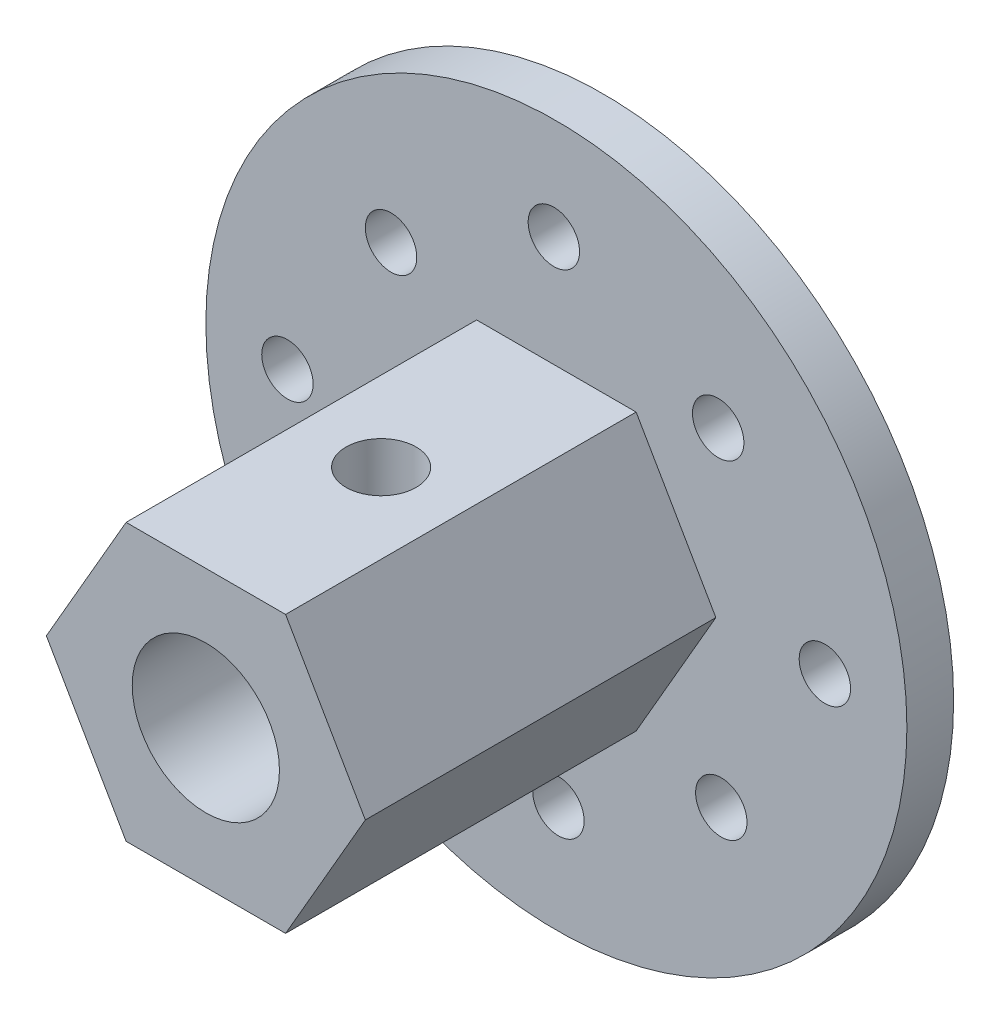
ISO-10303-21;
HEADER;
FILE_DESCRIPTION(('STEP AP214'),'2;1');
FILE_NAME('part.step','',(''),(''),'','','');
FILE_SCHEMA(('AUTOMOTIVE_DESIGN { 1 0 10303 214 1 1 1 1 }'));
ENDSEC;
DATA;
#1=APPLICATION_CONTEXT('core data for automotive mechanical design processes');
#2=APPLICATION_PROTOCOL_DEFINITION('international standard','automotive_design',2000,#1);
#3=PRODUCT_CONTEXT('',#1,'mechanical');
#4=PRODUCT('Part','Part','',(#3));
#5=PRODUCT_RELATED_PRODUCT_CATEGORY('part','',(#4));
#6=PRODUCT_DEFINITION_FORMATION('','',#4);
#7=PRODUCT_DEFINITION_CONTEXT('part definition',#1,'design');
#8=PRODUCT_DEFINITION('design','',#6,#7);
#9=PRODUCT_DEFINITION_SHAPE('','',#8);
#10=(LENGTH_UNIT() NAMED_UNIT(*) SI_UNIT(.MILLI.,.METRE.));
#11=(NAMED_UNIT(*) PLANE_ANGLE_UNIT() SI_UNIT($,.RADIAN.));
#12=(NAMED_UNIT(*) SI_UNIT($,.STERADIAN.) SOLID_ANGLE_UNIT());
#13=UNCERTAINTY_MEASURE_WITH_UNIT(LENGTH_MEASURE(1.E-05),#10,'distance_accuracy_value','');
#14=(GEOMETRIC_REPRESENTATION_CONTEXT(3) GLOBAL_UNCERTAINTY_ASSIGNED_CONTEXT((#13)) GLOBAL_UNIT_ASSIGNED_CONTEXT((#10,
#11,#12)) REPRESENTATION_CONTEXT('',''));
#15=CARTESIAN_POINT('',(0.,0.,0.));
#16=DIRECTION('',(0.,0.,1.));
#17=DIRECTION('',(1.,0.,0.));
#18=AXIS2_PLACEMENT_3D('',#15,#16,#17);
#19=CARTESIAN_POINT('',(0.,-5.9106233808288,15.));
#20=DIRECTION('',(0.,1.,0.));
#21=DIRECTION('',(-1.,0.,0.));
#22=AXIS2_PLACEMENT_3D('',#19,#20,#21);
#23=PLANE('',#22);
#24=CARTESIAN_POINT('',(0.,-5.9106233808288,7.5));
#25=DIRECTION('',(0.,1.,0.));
#26=DIRECTION('',(-1.,0.,0.));
#27=AXIS2_PLACEMENT_3D('',#24,#25,#26);
#28=CIRCLE('',#27,1.5);
#29=CARTESIAN_POINT('',(-1.5,-5.9106233808288,7.5));
#30=VERTEX_POINT('',#29);
#31=EDGE_CURVE('E222',#30,#30,#28,.T.);
#32=ORIENTED_EDGE('',*,*,#31,.T.);
#33=EDGE_LOOP('',(#32));
#34=FACE_BOUND('',#33,.T.);
#35=DIRECTION('',(1.,0.,0.));
#36=VECTOR('',#35,1.);
#37=CARTESIAN_POINT('',(0.,-5.9106233808288,0.));
#38=LINE('',#37,#36);
#39=CARTESIAN_POINT('',(-3.4125,-5.91062338082879,0.));
#40=VERTEX_POINT('',#39);
#41=CARTESIAN_POINT('',(3.4125,-5.9106233808288,0.));
#42=VERTEX_POINT('',#41);
#43=EDGE_CURVE('E97',#40,#42,#38,.T.);
#44=ORIENTED_EDGE('',*,*,#43,.T.);
#45=DIRECTION('',(0.,0.,-1.));
#46=VECTOR('',#45,1.);
#47=CARTESIAN_POINT('',(3.4125,-5.9106233808288,15.));
#48=LINE('',#47,#46);
#49=CARTESIAN_POINT('',(3.4125,-5.9106233808288,15.));
#50=VERTEX_POINT('',#49);
#51=EDGE_CURVE('E11',#50,#42,#48,.T.);
#52=ORIENTED_EDGE('',*,*,#51,.F.);
#53=DIRECTION('',(1.,0.,0.));
#54=VECTOR('',#53,1.);
#55=CARTESIAN_POINT('',(0.,-5.9106233808288,15.));
#56=LINE('',#55,#54);
#57=CARTESIAN_POINT('',(-3.4125,-5.91062338082879,15.));
#58=VERTEX_POINT('',#57);
#59=EDGE_CURVE('E283',#58,#50,#56,.T.);
#60=ORIENTED_EDGE('',*,*,#59,.F.);
#61=DIRECTION('',(0.,0.,-1.));
#62=VECTOR('',#61,1.);
#63=CARTESIAN_POINT('',(-3.4125,-5.91062338082879,15.));
#64=LINE('',#63,#62);
#65=EDGE_CURVE('E111',#58,#40,#64,.T.);
#66=ORIENTED_EDGE('',*,*,#65,.T.);
#67=EDGE_LOOP('',(#44,#52,#60,#66));
#68=FACE_BOUND('',#67,.T.);
#69=ADVANCED_FACE('F37',(#34,#68),#23,.F.);
#70=CARTESIAN_POINT('',(5.11875,-2.9553116904144,15.));
#71=DIRECTION('',(-0.866025403784439,0.5,0.));
#72=DIRECTION('',(-0.5,-0.866025403784439,0.));
#73=AXIS2_PLACEMENT_3D('',#70,#71,#72);
#74=PLANE('',#73);
#75=DIRECTION('',(0.5,0.866025403784439,0.));
#76=VECTOR('',#75,1.);
#77=CARTESIAN_POINT('',(5.11875,-2.9553116904144,0.));
#78=LINE('',#77,#76);
#79=CARTESIAN_POINT('',(6.825,0.,0.));
#80=VERTEX_POINT('',#79);
#81=EDGE_CURVE('E93',#42,#80,#78,.T.);
#82=ORIENTED_EDGE('',*,*,#81,.T.);
#83=DIRECTION('',(0.,0.,-1.));
#84=VECTOR('',#83,1.);
#85=CARTESIAN_POINT('',(6.825,0.,15.));
#86=LINE('',#85,#84);
#87=CARTESIAN_POINT('',(6.825,0.,15.));
#88=VERTEX_POINT('',#87);
#89=EDGE_CURVE('E52',#88,#80,#86,.T.);
#90=ORIENTED_EDGE('',*,*,#89,.F.);
#91=DIRECTION('',(0.5,0.866025403784439,0.));
#92=VECTOR('',#91,1.);
#93=CARTESIAN_POINT('',(5.11875,-2.9553116904144,15.));
#94=LINE('',#93,#92);
#95=EDGE_CURVE('E107',#50,#88,#94,.T.);
#96=ORIENTED_EDGE('',*,*,#95,.F.);
#97=ORIENTED_EDGE('',*,*,#51,.T.);
#98=EDGE_LOOP('',(#82,#90,#96,#97));
#99=FACE_BOUND('',#98,.T.);
#100=ADVANCED_FACE('F106',(#99),#74,.F.);
#101=CARTESIAN_POINT('',(5.11875,2.9553116904144,15.));
#102=DIRECTION('',(-0.866025403784439,-0.5,0.));
#103=DIRECTION('',(0.5,-0.866025403784439,0.));
#104=AXIS2_PLACEMENT_3D('',#101,#102,#103);
#105=PLANE('',#104);
#106=DIRECTION('',(-0.5,0.866025403784439,0.));
#107=VECTOR('',#106,1.);
#108=CARTESIAN_POINT('',(5.11875,2.9553116904144,0.));
#109=LINE('',#108,#107);
#110=CARTESIAN_POINT('',(3.4125,5.9106233808288,0.));
#111=VERTEX_POINT('',#110);
#112=EDGE_CURVE('E100',#80,#111,#109,.T.);
#113=ORIENTED_EDGE('',*,*,#112,.T.);
#114=DIRECTION('',(0.,0.,-1.));
#115=VECTOR('',#114,1.);
#116=CARTESIAN_POINT('',(3.4125,5.9106233808288,15.));
#117=LINE('',#116,#115);
#118=CARTESIAN_POINT('',(3.4125,5.9106233808288,15.));
#119=VERTEX_POINT('',#118);
#120=EDGE_CURVE('E137',#119,#111,#117,.T.);
#121=ORIENTED_EDGE('',*,*,#120,.F.);
#122=DIRECTION('',(-0.5,0.866025403784439,0.));
#123=VECTOR('',#122,1.);
#124=CARTESIAN_POINT('',(5.11875,2.9553116904144,15.));
#125=LINE('',#124,#123);
#126=EDGE_CURVE('E286',#88,#119,#125,.T.);
#127=ORIENTED_EDGE('',*,*,#126,.F.);
#128=ORIENTED_EDGE('',*,*,#89,.T.);
#129=EDGE_LOOP('',(#113,#121,#127,#128));
#130=FACE_BOUND('',#129,.T.);
#131=ADVANCED_FACE('F210',(#130),#105,.F.);
#132=CARTESIAN_POINT('',(0.,5.9106233808288,15.));
#133=DIRECTION('',(0.,-1.,0.));
#134=DIRECTION('',(1.,0.,0.));
#135=AXIS2_PLACEMENT_3D('',#132,#133,#134);
#136=PLANE('',#135);
#137=CARTESIAN_POINT('',(0.,5.9106233808288,7.5));
#138=DIRECTION('',(0.,1.,0.));
#139=DIRECTION('',(-1.,0.,0.));
#140=AXIS2_PLACEMENT_3D('',#137,#138,#139);
#141=CIRCLE('',#140,1.5);
#142=CARTESIAN_POINT('',(-1.5,5.9106233808288,7.5));
#143=VERTEX_POINT('',#142);
#144=EDGE_CURVE('E145',#143,#143,#141,.T.);
#145=ORIENTED_EDGE('',*,*,#144,.F.);
#146=EDGE_LOOP('',(#145));
#147=FACE_BOUND('',#146,.T.);
#148=DIRECTION('',(-1.,0.,0.));
#149=VECTOR('',#148,1.);
#150=CARTESIAN_POINT('',(0.,5.9106233808288,0.));
#151=LINE('',#150,#149);
#152=CARTESIAN_POINT('',(-3.4125,5.9106233808288,0.));
#153=VERTEX_POINT('',#152);
#154=EDGE_CURVE('E121',#111,#153,#151,.T.);
#155=ORIENTED_EDGE('',*,*,#154,.T.);
#156=DIRECTION('',(0.,0.,-1.));
#157=VECTOR('',#156,1.);
#158=CARTESIAN_POINT('',(-3.4125,5.9106233808288,15.));
#159=LINE('',#158,#157);
#160=CARTESIAN_POINT('',(-3.4125,5.9106233808288,15.));
#161=VERTEX_POINT('',#160);
#162=EDGE_CURVE('E134',#161,#153,#159,.T.);
#163=ORIENTED_EDGE('',*,*,#162,.F.);
#164=DIRECTION('',(-1.,0.,0.));
#165=VECTOR('',#164,1.);
#166=CARTESIAN_POINT('',(0.,5.9106233808288,15.));
#167=LINE('',#166,#165);
#168=EDGE_CURVE('E288',#119,#161,#167,.T.);
#169=ORIENTED_EDGE('',*,*,#168,.F.);
#170=ORIENTED_EDGE('',*,*,#120,.T.);
#171=EDGE_LOOP('',(#155,#163,#169,#170));
#172=FACE_BOUND('',#171,.T.);
#173=ADVANCED_FACE('F206',(#147,#172),#136,.F.);
#174=CARTESIAN_POINT('',(-5.11875,2.9553116904144,15.));
#175=DIRECTION('',(0.866025403784439,-0.5,0.));
#176=DIRECTION('',(0.5,0.866025403784439,0.));
#177=AXIS2_PLACEMENT_3D('',#174,#175,#176);
#178=PLANE('',#177);
#179=DIRECTION('',(-0.5,-0.866025403784439,0.));
#180=VECTOR('',#179,1.);
#181=CARTESIAN_POINT('',(-5.11875,2.9553116904144,0.));
#182=LINE('',#181,#180);
#183=CARTESIAN_POINT('',(-6.825,0.,0.));
#184=VERTEX_POINT('',#183);
#185=EDGE_CURVE('E124',#153,#184,#182,.T.);
#186=ORIENTED_EDGE('',*,*,#185,.T.);
#187=DIRECTION('',(0.,0.,-1.));
#188=VECTOR('',#187,1.);
#189=CARTESIAN_POINT('',(-6.825,0.,15.));
#190=LINE('',#189,#188);
#191=CARTESIAN_POINT('',(-6.825,0.,15.));
#192=VERTEX_POINT('',#191);
#193=EDGE_CURVE('E131',#192,#184,#190,.T.);
#194=ORIENTED_EDGE('',*,*,#193,.F.);
#195=DIRECTION('',(-0.5,-0.866025403784439,0.));
#196=VECTOR('',#195,1.);
#197=CARTESIAN_POINT('',(-5.11875,2.9553116904144,15.));
#198=LINE('',#197,#196);
#199=EDGE_CURVE('E289',#161,#192,#198,.T.);
#200=ORIENTED_EDGE('',*,*,#199,.F.);
#201=ORIENTED_EDGE('',*,*,#162,.T.);
#202=EDGE_LOOP('',(#186,#194,#200,#201));
#203=FACE_BOUND('',#202,.T.);
#204=ADVANCED_FACE('F203',(#203),#178,.F.);
#205=CARTESIAN_POINT('',(0.,0.,15.));
#206=DIRECTION('',(0.,0.,-1.));
#207=DIRECTION('',(-1.,0.,0.));
#208=AXIS2_PLACEMENT_3D('',#205,#206,#207);
#209=CYLINDRICAL_SURFACE('',#208,3.15);
#210=CARTESIAN_POINT('',(-1.5,-2.76992779689291,7.5));
#211=CARTESIAN_POINT('',(-1.49999512828054,-2.76993355691465,7.57872488532269));
#212=CARTESIAN_POINT('',(-1.49376181526376,-2.77333403488741,7.65756185561535));
#213=CARTESIAN_POINT('',(-1.46912569232975,-2.78645890771976,7.81286106870493));
#214=CARTESIAN_POINT('',(-1.45069492745545,-2.79619782860643,7.88931743301203));
#215=CARTESIAN_POINT('',(-1.40260850542124,-2.82062152123807,8.03732147343197));
#216=CARTESIAN_POINT('',(-1.37300820581179,-2.8352818629121,8.10889133468752));
#217=CARTESIAN_POINT('',(-1.30359090354353,-2.86785913338934,8.24603198704063));
#218=CARTESIAN_POINT('',(-1.26377419981075,-2.88577596690503,8.31160295358621));
#219=CARTESIAN_POINT('',(-1.17157340786821,-2.92448170601209,8.44028578083248));
#220=CARTESIAN_POINT('',(-1.11847444649718,-2.94538512566762,8.50285124762856));
#221=CARTESIAN_POINT('',(-1.00270750312831,-2.98678034208223,8.61860748151321));
#222=CARTESIAN_POINT('',(-0.940035134894633,-3.00727194526521,8.67179392723941));
#223=CARTESIAN_POINT('',(-0.802317251690317,-3.04700129599587,8.77038371492235));
#224=CARTESIAN_POINT('',(-0.726756178783365,-3.06609096429287,8.81513211812391));
#225=CARTESIAN_POINT('',(-0.56810053101371,-3.09940545699353,8.89103604275899));
#226=CARTESIAN_POINT('',(-0.485010311532368,-3.11363307150366,8.92219936287959));
#227=CARTESIAN_POINT('',(-0.319429022533573,-3.13479947496421,8.96794099194401));
#228=CARTESIAN_POINT('',(-0.237255730091782,-3.14215492850824,8.98347258106389));
#229=CARTESIAN_POINT('',(-0.0711644119017913,-3.15029110072656,9.00063147644495));
#230=CARTESIAN_POINT('',(0.0127526438372442,-3.15107538154907,9.00226631596237));
#231=CARTESIAN_POINT('',(0.17285517871007,-3.14619314795333,8.99199352604636));
#232=CARTESIAN_POINT('',(0.249127419883694,-3.14103170182195,8.98114628383523));
#233=CARTESIAN_POINT('',(0.398616200858829,-3.12558047721987,8.94809051131312));
#234=CARTESIAN_POINT('',(0.471832512939892,-3.11529031730662,8.92588113595246));
#235=CARTESIAN_POINT('',(0.61446159029421,-3.09034956876121,8.87053915939075));
#236=CARTESIAN_POINT('',(0.683802738834998,-3.07563718497101,8.83725098731157));
#237=CARTESIAN_POINT('',(0.816091361413133,-3.04321219161389,8.76088636320448));
#238=CARTESIAN_POINT('',(0.879036485250617,-3.02549848555182,8.7178063318733));
#239=CARTESIAN_POINT('',(1.00263565644441,-2.98693359674348,8.61871978348667));
#240=CARTESIAN_POINT('',(1.0626034705047,-2.96594349598994,8.56191048118762));
#241=CARTESIAN_POINT('',(1.17251105126579,-2.92424012507112,8.43915500531423));
#242=CARTESIAN_POINT('',(1.22244433756614,-2.90352704181393,8.37320297342745));
#243=CARTESIAN_POINT('',(1.3134528172033,-2.86355477768291,8.22968339508249));
#244=CARTESIAN_POINT('',(1.35391191761259,-2.84443247625902,8.15168342647286));
#245=CARTESIAN_POINT('',(1.42083061462904,-2.81160888291967,7.98884448260634));
#246=CARTESIAN_POINT('',(1.4473035975326,-2.79790241062308,7.90401213667877));
#247=CARTESIAN_POINT('',(1.48347362827959,-2.7788839951775,7.73676167517786));
#248=CARTESIAN_POINT('',(1.49429589447754,-2.77301167486687,7.65465266939844));
#249=CARTESIAN_POINT('',(1.50223397235311,-2.76872169565055,7.48959977548907));
#250=CARTESIAN_POINT('',(1.49935759309064,-2.7702997895518,7.40665638991228));
#251=CARTESIAN_POINT('',(1.48101219124526,-2.78014161682937,7.2506272582168));
#252=CARTESIAN_POINT('',(1.46676047668064,-2.78775860512234,7.17735138756969));
#253=CARTESIAN_POINT('',(1.42781659425282,-2.80790253393829,7.0343443678185));
#254=CARTESIAN_POINT('',(1.4031214003218,-2.82043089748814,6.96461425268626));
#255=CARTESIAN_POINT('',(1.34276490341884,-2.84967581803499,6.82703139696087));
#256=CARTESIAN_POINT('',(1.30664900322602,-2.86655936350107,6.75941487156065));
#257=CARTESIAN_POINT('',(1.22488682758906,-2.90243763216396,6.63082541251736));
#258=CARTESIAN_POINT('',(1.17923577082519,-2.92143341227884,6.56985583536057));
#259=CARTESIAN_POINT('',(1.07370241705516,-2.96195883240757,6.44914911308566));
#260=CARTESIAN_POINT('',(1.01279842919393,-2.98353379263769,6.39031643670938));
#261=CARTESIAN_POINT('',(0.881582089646963,-3.02490381214683,6.28345862793802));
#262=CARTESIAN_POINT('',(0.811267455642678,-3.04469843769656,6.23543612488326));
#263=CARTESIAN_POINT('',(0.661420256758403,-3.08075602911564,6.15090877907066));
#264=CARTESIAN_POINT('',(0.581746602897407,-3.09695030800855,6.11462276623818));
#265=CARTESIAN_POINT('',(0.416436183797379,-3.12347018905937,6.05630827954424));
#266=CARTESIAN_POINT('',(0.330804221585407,-3.13380045809116,6.03426846589809));
#267=CARTESIAN_POINT('',(0.16395502730365,-3.14674636742887,6.00680095019335));
#268=CARTESIAN_POINT('',(0.0829908258945927,-3.14994869644787,6.00010840477039));
#269=CARTESIAN_POINT('',(-0.0789479789493272,-3.15005000669313,5.99989431882655));
#270=CARTESIAN_POINT('',(-0.159922572680317,-3.14695080219962,6.00636898732128));
#271=CARTESIAN_POINT('',(-0.314828784707275,-3.13513721365548,6.03143068136368));
#272=CARTESIAN_POINT('',(-0.388900742448287,-3.12674738284226,6.04931828339357));
#273=CARTESIAN_POINT('',(-0.532900023334838,-3.10544993028493,6.09581160586742));
#274=CARTESIAN_POINT('',(-0.602826693967297,-3.09254159947649,6.12441900856275));
#275=CARTESIAN_POINT('',(-0.740049022805659,-3.06267525837221,6.19291509294018));
#276=CARTESIAN_POINT('',(-0.80708598335687,-3.04556157311282,6.23325223242839));
#277=CARTESIAN_POINT('',(-0.933730397713657,-3.00915215544564,6.32347980584785));
#278=CARTESIAN_POINT('',(-0.993334440684814,-2.98985542896844,6.37337459917846));
#279=CARTESIAN_POINT('',(-1.10911159559092,-2.94897855229333,6.48658564710739));
#280=CARTESIAN_POINT('',(-1.16448035503823,-2.92735028268804,6.55070963645063));
#281=CARTESIAN_POINT('',(-1.26391547857037,-2.88581526519611,6.68778712048229));
#282=CARTESIAN_POINT('',(-1.30797333352128,-2.86590982080038,6.76074720214469));
#283=CARTESIAN_POINT('',(-1.3840936929618,-2.82994621207585,6.91532774518253));
#284=CARTESIAN_POINT('',(-1.41592364698007,-2.81396454115983,6.99708149975433));
#285=CARTESIAN_POINT('',(-1.46489257204971,-2.78879350795625,7.16572186137652));
#286=CARTESIAN_POINT('',(-1.48208085585884,-2.7795813606081,7.25259017719949));
#287=CARTESIAN_POINT('',(-1.49431908572158,-2.77299732052517,7.36686147740226));
#288=CARTESIAN_POINT('',(-1.49644673622212,-2.77184948473868,7.39342693789545));
#289=CARTESIAN_POINT('',(-1.4992880568787,-2.77031372650367,7.44665730497053));
#290=CARTESIAN_POINT('',(-1.50000165089698,-2.76992584497376,7.47332221682977));
#291=CARTESIAN_POINT('',(-1.5,-2.76992779689291,7.5));
#292=B_SPLINE_CURVE_WITH_KNOTS('',3,(#210,#211,#212,#213,#214,#215,#216,#217,#218,#219,#220,
#221,#222,#223,#224,#225,#226,#227,#228,#229,#230,#231,#232,#233,#234,#235,#236,#237,#238,#239,
#240,#241,#242,#243,#244,#245,#246,#247,#248,#249,#250,#251,#252,#253,#254,#255,#256,#257,#258,
#259,#260,#261,#262,#263,#264,#265,#266,#267,#268,#269,#270,#271,#272,#273,#274,#275,#276,#277,
#278,#279,#280,#281,#282,#283,#284,#285,#286,#287,#288,#289,#290,#291),.UNSPECIFIED.,.T.,.F.,(4,
2,2,2,2,2,2,2,2,2,2,2,2,2,2,2,2,2,2,2,2,2,2,2,2,2,2,2,2,2,2,2,2,2,2,2,2,2,2,2,4),(0.,
0.236062528288999,0.47266796322516,0.708115835199148,0.94355681889115,1.196523813196,
1.44960705864778,1.71781237472466,1.98586352077446,2.23634315664763,2.48668700194077,
2.71723982814652,2.94780980403002,3.18176463911911,3.41580513167643,3.67039162386814,
3.9251420059496,4.19350831731647,4.46161730429607,4.70928363591595,4.95680879958984,
5.18091237777868,5.40508093601456,5.63962346787715,5.87428389258181,6.13525202478639,
6.39628356341156,6.66193382710884,6.92737237549041,7.16999959899019,7.41255697735767,
7.64151551807625,7.87051000416771,8.10977586194789,8.34915111370967,8.61028530696864,
8.87161537822315,9.13769476445408,9.40287441868371,9.48286546420592,9.56286081660936),.UNSPECIFIED.);
#293=CARTESIAN_POINT('',(-1.5,-2.76992779689291,7.5));
#294=VERTEX_POINT('',#293);
#295=EDGE_CURVE('E42',#294,#294,#292,.T.);
#296=ORIENTED_EDGE('',*,*,#295,.F.);
#297=EDGE_LOOP('',(#296));
#298=FACE_BOUND('',#297,.T.);
#299=CARTESIAN_POINT('',(-1.5,2.76992779689291,7.5));
#300=CARTESIAN_POINT('',(-1.49999512828054,2.76993355691465,7.42127511467731));
#301=CARTESIAN_POINT('',(-1.49376181526375,2.77333403488741,7.34243814438465));
#302=CARTESIAN_POINT('',(-1.46912569232975,2.78645890771976,7.18713893129507));
#303=CARTESIAN_POINT('',(-1.45069492745545,2.79619782860643,7.11068256698797));
#304=CARTESIAN_POINT('',(-1.40260850542124,2.82062152123807,6.96267852656803));
#305=CARTESIAN_POINT('',(-1.37300820581179,2.8352818629121,6.89110866531248));
#306=CARTESIAN_POINT('',(-1.30359090354353,2.86785913338934,6.75396801295937));
#307=CARTESIAN_POINT('',(-1.26377419981075,2.88577596690503,6.68839704641379));
#308=CARTESIAN_POINT('',(-1.17157340786822,2.92448170601209,6.55971421916753));
#309=CARTESIAN_POINT('',(-1.11847444649718,2.94538512566762,6.49714875237144));
#310=CARTESIAN_POINT('',(-1.00270750312832,2.98678034208223,6.3813925184868));
#311=CARTESIAN_POINT('',(-0.940035134894635,3.00727194526521,6.32820607276059));
#312=CARTESIAN_POINT('',(-0.80231725169032,3.04700129599587,6.22961628507766));
#313=CARTESIAN_POINT('',(-0.726756178783368,3.06609096429287,6.18486788187609));
#314=CARTESIAN_POINT('',(-0.568100531013713,3.09940545699353,6.10896395724102));
#315=CARTESIAN_POINT('',(-0.485010311532371,3.11363307150366,6.07780063712041));
#316=CARTESIAN_POINT('',(-0.319429022533576,3.13479947496421,6.03205900805599));
#317=CARTESIAN_POINT('',(-0.237255730091784,3.14215492850824,6.01652741893612));
#318=CARTESIAN_POINT('',(-0.0711644119017936,3.15029110072656,5.99936852355505));
#319=CARTESIAN_POINT('',(0.0127526438372422,3.15107538154907,5.99773368403763));
#320=CARTESIAN_POINT('',(0.172855178710069,3.14619314795334,6.00800647395364));
#321=CARTESIAN_POINT('',(0.249127419883693,3.14103170182195,6.01885371616476));
#322=CARTESIAN_POINT('',(0.398616200858829,3.12558047721987,6.05190948868687));
#323=CARTESIAN_POINT('',(0.471832512939892,3.11529031730662,6.07411886404754));
#324=CARTESIAN_POINT('',(0.61446159029421,3.09034956876121,6.12946084060924));
#325=CARTESIAN_POINT('',(0.683802738834999,3.07563718497101,6.16274901268843));
#326=CARTESIAN_POINT('',(0.816091361413134,3.04321219161389,6.23911363679552));
#327=CARTESIAN_POINT('',(0.879036485250618,3.02549848555182,6.2821936681267));
#328=CARTESIAN_POINT('',(1.00263565644441,2.98693359674348,6.38128021651333));
#329=CARTESIAN_POINT('',(1.0626034705047,2.96594349598994,6.43808951881239));
#330=CARTESIAN_POINT('',(1.17251105126579,2.92424012507112,6.56084499468577));
#331=CARTESIAN_POINT('',(1.22244433756614,2.90352704181393,6.62679702657255));
#332=CARTESIAN_POINT('',(1.3134528172033,2.8635547776829,6.77031660491751));
#333=CARTESIAN_POINT('',(1.35391191761259,2.84443247625901,6.84831657352714));
#334=CARTESIAN_POINT('',(1.42083061462904,2.81160888291967,7.01115551739366));
#335=CARTESIAN_POINT('',(1.4473035975326,2.79790241062308,7.09598786332123));
#336=CARTESIAN_POINT('',(1.48347362827959,2.7788839951775,7.26323832482214));
#337=CARTESIAN_POINT('',(1.49429589447754,2.77301167486687,7.34534733060156));
#338=CARTESIAN_POINT('',(1.50223397235311,2.76872169565055,7.51040022451093));
#339=CARTESIAN_POINT('',(1.49935759309064,2.7702997895518,7.59334361008771));
#340=CARTESIAN_POINT('',(1.48101219124526,2.78014161682937,7.7493727417832));
#341=CARTESIAN_POINT('',(1.46676047668064,2.78775860512234,7.82264861243031));
#342=CARTESIAN_POINT('',(1.42781659425282,2.80790253393829,7.96565563218149));
#343=CARTESIAN_POINT('',(1.4031214003218,2.82043089748814,8.03538574731374));
#344=CARTESIAN_POINT('',(1.34276490341884,2.84967581803499,8.17296860303912));
#345=CARTESIAN_POINT('',(1.30664900322602,2.86655936350107,8.24058512843934));
#346=CARTESIAN_POINT('',(1.22488682758907,2.90243763216396,8.36917458748264));
#347=CARTESIAN_POINT('',(1.1792357708252,2.92143341227884,8.43014416463942));
#348=CARTESIAN_POINT('',(1.07370241705516,2.96195883240757,8.55085088691434));
#349=CARTESIAN_POINT('',(1.01279842919393,2.98353379263769,8.60968356329061));
#350=CARTESIAN_POINT('',(0.881582089646968,3.02490381214683,8.71654137206197));
#351=CARTESIAN_POINT('',(0.811267455642682,3.04469843769656,8.76456387511674));
#352=CARTESIAN_POINT('',(0.661420256758408,3.08075602911564,8.84909122092933));
#353=CARTESIAN_POINT('',(0.581746602897413,3.09695030800854,8.88537723376182));
#354=CARTESIAN_POINT('',(0.416436183797384,3.12347018905937,8.94369172045575));
#355=CARTESIAN_POINT('',(0.330804221585413,3.13380045809116,8.96573153410191));
#356=CARTESIAN_POINT('',(0.163955027303656,3.14674636742887,8.99319904980665));
#357=CARTESIAN_POINT('',(0.0829908258945979,3.14994869644787,8.99989159522961));
#358=CARTESIAN_POINT('',(-0.0789479789493226,3.15005000669313,9.00010568117345));
#359=CARTESIAN_POINT('',(-0.159922572680313,3.14695080219962,8.99363101267872));
#360=CARTESIAN_POINT('',(-0.31482878470727,3.13513721365548,8.96856931863632));
#361=CARTESIAN_POINT('',(-0.388900742448283,3.12674738284226,8.95068171660643));
#362=CARTESIAN_POINT('',(-0.532900023334834,3.10544993028493,8.90418839413258));
#363=CARTESIAN_POINT('',(-0.602826693967294,3.09254159947649,8.87558099143725));
#364=CARTESIAN_POINT('',(-0.740049022805657,3.06267525837221,8.80708490705982));
#365=CARTESIAN_POINT('',(-0.807085983356869,3.04556157311282,8.76674776757161));
#366=CARTESIAN_POINT('',(-0.933730397713656,3.00915215544564,8.67652019415215));
#367=CARTESIAN_POINT('',(-0.993334440684814,2.98985542896844,8.62662540082154));
#368=CARTESIAN_POINT('',(-1.10911159559092,2.94897855229333,8.51341435289261));
#369=CARTESIAN_POINT('',(-1.16448035503823,2.92735028268804,8.44929036354937));
#370=CARTESIAN_POINT('',(-1.26391547857037,2.88581526519611,8.31221287951771));
#371=CARTESIAN_POINT('',(-1.30797333352127,2.86590982080038,8.23925279785531));
#372=CARTESIAN_POINT('',(-1.3840936929618,2.82994621207585,8.08467225481747));
#373=CARTESIAN_POINT('',(-1.41592364698007,2.81396454115983,8.00291850024567));
#374=CARTESIAN_POINT('',(-1.4648925720497,2.78879350795625,7.83427813862348));
#375=CARTESIAN_POINT('',(-1.48208085585884,2.7795813606081,7.74740982280051));
#376=CARTESIAN_POINT('',(-1.49431908572158,2.77299732052517,7.63313852259774));
#377=CARTESIAN_POINT('',(-1.49644673622212,2.77184948473868,7.60657306210455));
#378=CARTESIAN_POINT('',(-1.4992880568787,2.77031372650367,7.55334269502947));
#379=CARTESIAN_POINT('',(-1.50000165089698,2.76992584497376,7.52667778317023));
#380=CARTESIAN_POINT('',(-1.5,2.76992779689291,7.5));
#381=B_SPLINE_CURVE_WITH_KNOTS('',3,(#299,#300,#301,#302,#303,#304,#305,#306,#307,#308,#309,
#310,#311,#312,#313,#314,#315,#316,#317,#318,#319,#320,#321,#322,#323,#324,#325,#326,#327,#328,
#329,#330,#331,#332,#333,#334,#335,#336,#337,#338,#339,#340,#341,#342,#343,#344,#345,#346,#347,
#348,#349,#350,#351,#352,#353,#354,#355,#356,#357,#358,#359,#360,#361,#362,#363,#364,#365,#366,
#367,#368,#369,#370,#371,#372,#373,#374,#375,#376,#377,#378,#379,#380),.UNSPECIFIED.,.T.,.F.,(4,
2,2,2,2,2,2,2,2,2,2,2,2,2,2,2,2,2,2,2,2,2,2,2,2,2,2,2,2,2,2,2,2,2,2,2,2,2,2,2,4),(0.,
0.236062528288998,0.472667963225158,0.708115835199147,0.943556818891147,1.19652381319599,
1.44960705864778,1.71781237472465,1.98586352077446,2.23634315664763,2.48668700194077,
2.71723982814652,2.94780980403002,3.18176463911911,3.41580513167643,3.67039162386815,
3.9251420059496,4.19350831731648,4.46161730429607,4.70928363591595,4.95680879958984,
5.18091237777868,5.40508093601456,5.63962346787714,5.8742838925818,6.13525202478639,
6.39628356341156,6.66193382710884,6.92737237549041,7.16999959899019,7.41255697735766,
7.64151551807624,7.8705100041677,8.10977586194789,8.34915111370967,8.61028530696864,
8.87161537822315,9.13769476445407,9.40287441868371,9.48286546420591,9.56286081660936),.UNSPECIFIED.);
#382=CARTESIAN_POINT('',(-1.5,2.76992779689291,7.5));
#383=VERTEX_POINT('',#382);
#384=EDGE_CURVE('E140',#383,#383,#381,.T.);
#385=ORIENTED_EDGE('',*,*,#384,.F.);
#386=EDGE_LOOP('',(#385));
#387=FACE_BOUND('',#386,.T.);
#388=CARTESIAN_POINT('',(0.,0.,15.));
#389=DIRECTION('',(0.,0.,1.));
#390=DIRECTION('',(1.,0.,0.));
#391=AXIS2_PLACEMENT_3D('',#388,#389,#390);
#392=CIRCLE('',#391,3.15);
#393=CARTESIAN_POINT('',(3.15,0.,15.));
#394=VERTEX_POINT('',#393);
#395=EDGE_CURVE('E129',#394,#394,#392,.T.);
#396=ORIENTED_EDGE('',*,*,#395,.T.);
#397=EDGE_LOOP('',(#396));
#398=FACE_BOUND('',#397,.T.);
#399=CARTESIAN_POINT('',(0.,0.,-2.));
#400=DIRECTION('',(0.,0.,-1.));
#401=DIRECTION('',(-1.,0.,0.));
#402=AXIS2_PLACEMENT_3D('',#399,#400,#401);
#403=CIRCLE('',#402,3.15);
#404=CARTESIAN_POINT('',(-3.15,0.,-2.));
#405=VERTEX_POINT('',#404);
#406=EDGE_CURVE('E274',#405,#405,#403,.T.);
#407=ORIENTED_EDGE('',*,*,#406,.T.);
#408=EDGE_LOOP('',(#407));
#409=FACE_BOUND('',#408,.T.);
#410=ADVANCED_FACE('F39',(#298,#387,#398,#409),#209,.F.);
#411=CARTESIAN_POINT('',(-5.11875,-2.9553116904144,15.));
#412=DIRECTION('',(0.866025403784439,0.5,0.));
#413=DIRECTION('',(-0.5,0.866025403784439,0.));
#414=AXIS2_PLACEMENT_3D('',#411,#412,#413);
#415=PLANE('',#414);
#416=DIRECTION('',(0.5,-0.866025403784439,0.));
#417=VECTOR('',#416,1.);
#418=CARTESIAN_POINT('',(-5.11875,-2.9553116904144,0.));
#419=LINE('',#418,#417);
#420=EDGE_CURVE('E127',#184,#40,#419,.T.);
#421=ORIENTED_EDGE('',*,*,#420,.T.);
#422=ORIENTED_EDGE('',*,*,#65,.F.);
#423=DIRECTION('',(0.5,-0.866025403784439,0.));
#424=VECTOR('',#423,1.);
#425=CARTESIAN_POINT('',(-5.11875,-2.9553116904144,15.));
#426=LINE('',#425,#424);
#427=EDGE_CURVE('E60',#192,#58,#426,.T.);
#428=ORIENTED_EDGE('',*,*,#427,.F.);
#429=ORIENTED_EDGE('',*,*,#193,.T.);
#430=EDGE_LOOP('',(#421,#422,#428,#429));
#431=FACE_BOUND('',#430,.T.);
#432=ADVANCED_FACE('F198',(#431),#415,.F.);
#433=CARTESIAN_POINT('',(0.,0.,15.));
#434=DIRECTION('',(0.,0.,1.));
#435=DIRECTION('',(1.,0.,0.));
#436=AXIS2_PLACEMENT_3D('',#433,#434,#435);
#437=PLANE('',#436);
#438=ORIENTED_EDGE('',*,*,#395,.F.);
#439=EDGE_LOOP('',(#438));
#440=FACE_BOUND('',#439,.T.);
#441=ORIENTED_EDGE('',*,*,#59,.T.);
#442=ORIENTED_EDGE('',*,*,#95,.T.);
#443=ORIENTED_EDGE('',*,*,#126,.T.);
#444=ORIENTED_EDGE('',*,*,#168,.T.);
#445=ORIENTED_EDGE('',*,*,#199,.T.);
#446=ORIENTED_EDGE('',*,*,#427,.T.);
#447=EDGE_LOOP('',(#441,#442,#443,#444,#445,#446));
#448=FACE_BOUND('',#447,.T.);
#449=ADVANCED_FACE('F189',(#440,#448),#437,.T.);
#450=CARTESIAN_POINT('',(0.,0.,-2.));
#451=DIRECTION('',(0.,0.,-1.));
#452=DIRECTION('',(-1.,0.,0.));
#453=AXIS2_PLACEMENT_3D('',#450,#451,#452);
#454=PLANE('',#453);
#455=CARTESIAN_POINT('',(11.4897170307556,0.249365430280582,-2.));
#456=DIRECTION('',(0.,0.,-1.));
#457=DIRECTION('',(-1.,0.,0.));
#458=AXIS2_PLACEMENT_3D('',#455,#456,#457);
#459=CIRCLE('',#458,1.1);
#460=CARTESIAN_POINT('',(10.3897170307556,0.249365430280582,-2.));
#461=VERTEX_POINT('',#460);
#462=EDGE_CURVE('E235',#461,#461,#459,.T.);
#463=ORIENTED_EDGE('',*,*,#462,.F.);
#464=EDGE_LOOP('',(#463));
#465=FACE_BOUND('',#464,.T.);
#466=CARTESIAN_POINT('',(0.0880192296325855,-10.3573089441231,-2.));
#467=DIRECTION('',(0.,0.,-1.));
#468=DIRECTION('',(-1.,0.,0.));
#469=AXIS2_PLACEMENT_3D('',#466,#467,#468);
#470=CIRCLE('',#469,1.1);
#471=CARTESIAN_POINT('',(-1.01198077036741,-10.3573089441231,-2.));
#472=VERTEX_POINT('',#471);
#473=EDGE_CURVE('E247',#472,#472,#470,.T.);
#474=ORIENTED_EDGE('',*,*,#473,.F.);
#475=EDGE_LOOP('',(#474));
#476=FACE_BOUND('',#475,.T.);
#477=CARTESIAN_POINT('',(-11.5092825963894,0.0348516770899928,-2.));
#478=DIRECTION('',(0.,0.,-1.));
#479=DIRECTION('',(-1.,0.,0.));
#480=AXIS2_PLACEMENT_3D('',#477,#478,#479);
#481=CIRCLE('',#480,1.1);
#482=CARTESIAN_POINT('',(-12.6092825963894,0.0348516770899928,-2.));
#483=VERTEX_POINT('',#482);
#484=EDGE_CURVE('E259',#483,#483,#481,.T.);
#485=ORIENTED_EDGE('',*,*,#484,.F.);
#486=EDGE_LOOP('',(#485));
#487=FACE_BOUND('',#486,.T.);
#488=CARTESIAN_POINT('',(-0.10784115371535,10.6417776719663,-2.));
#489=DIRECTION('',(0.,0.,-1.));
#490=DIRECTION('',(-1.,0.,0.));
#491=AXIS2_PLACEMENT_3D('',#488,#489,#490);
#492=CIRCLE('',#491,1.1);
#493=CARTESIAN_POINT('',(-1.20784115371535,10.6417776719663,-2.));
#494=VERTEX_POINT('',#493);
#495=EDGE_CURVE('E271',#494,#494,#492,.T.);
#496=ORIENTED_EDGE('',*,*,#495,.F.);
#497=EDGE_LOOP('',(#496));
#498=FACE_BOUND('',#497,.T.);
#499=CARTESIAN_POINT('',(0.,0.,-2.));
#500=DIRECTION('',(0.,0.,-1.));
#501=DIRECTION('',(-1.,0.,0.));
#502=AXIS2_PLACEMENT_3D('',#499,#500,#501);
#503=CIRCLE('',#502,15.);
#504=CARTESIAN_POINT('',(-15.,0.,-2.));
#505=VERTEX_POINT('',#504);
#506=EDGE_CURVE('E112',#505,#505,#503,.T.);
#507=ORIENTED_EDGE('',*,*,#506,.T.);
#508=EDGE_LOOP('',(#507));
#509=FACE_BOUND('',#508,.T.);
#510=ORIENTED_EDGE('',*,*,#406,.F.);
#511=EDGE_LOOP('',(#510));
#512=FACE_BOUND('',#511,.T.);
#513=CARTESIAN_POINT('',(-7.0747014841026,6.94936796761442,-2.));
#514=DIRECTION('',(0.,0.,-1.));
#515=DIRECTION('',(-1.,0.,0.));
#516=AXIS2_PLACEMENT_3D('',#513,#514,#515);
#517=CIRCLE('',#516,1.1);
#518=CARTESIAN_POINT('',(-8.1747014841026,6.94936796761442,-2.));
#519=VERTEX_POINT('',#518);
#520=EDGE_CURVE('E265',#519,#519,#517,.T.);
#521=ORIENTED_EDGE('',*,*,#520,.F.);
#522=EDGE_LOOP('',(#521));
#523=FACE_BOUND('',#522,.T.);
#524=CARTESIAN_POINT('',(-6.9423578885112,-7.05043442730042,-2.));
#525=DIRECTION('',(0.,0.,-1.));
#526=DIRECTION('',(-1.,0.,0.));
#527=AXIS2_PLACEMENT_3D('',#524,#525,#526);
#528=CIRCLE('',#527,1.1);
#529=CARTESIAN_POINT('',(-8.0423578885112,-7.05043442730042,-2.));
#530=VERTEX_POINT('',#529);
#531=EDGE_CURVE('E253',#530,#530,#528,.T.);
#532=ORIENTED_EDGE('',*,*,#531,.F.);
#533=EDGE_LOOP('',(#532));
#534=FACE_BOUND('',#533,.T.);
#535=CARTESIAN_POINT('',(7.05760411117929,-6.919535442509,-2.));
#536=DIRECTION('',(0.,0.,-1.));
#537=DIRECTION('',(-1.,0.,0.));
#538=AXIS2_PLACEMENT_3D('',#535,#536,#537);
#539=CIRCLE('',#538,1.1);
#540=CARTESIAN_POINT('',(5.95760411117929,-6.919535442509,-2.));
#541=VERTEX_POINT('',#540);
#542=EDGE_CURVE('E241',#541,#541,#539,.T.);
#543=ORIENTED_EDGE('',*,*,#542,.F.);
#544=EDGE_LOOP('',(#543));
#545=FACE_BOUND('',#544,.T.);
#546=CARTESIAN_POINT('',(6.92452453817553,7.07728655841704,-2.));
#547=DIRECTION('',(0.,0.,-1.));
#548=DIRECTION('',(-1.,0.,0.));
#549=AXIS2_PLACEMENT_3D('',#546,#547,#548);
#550=CIRCLE('',#549,1.1);
#551=CARTESIAN_POINT('',(5.82452453817553,7.07728655841704,-2.));
#552=VERTEX_POINT('',#551);
#553=EDGE_CURVE('E227',#552,#552,#550,.T.);
#554=ORIENTED_EDGE('',*,*,#553,.F.);
#555=EDGE_LOOP('',(#554));
#556=FACE_BOUND('',#555,.T.);
#557=ADVANCED_FACE('F186',(#465,#476,#487,#498,#509,#512,#523,#534,#545,#556),#454,.T.);
#558=CARTESIAN_POINT('',(0.,0.,0.));
#559=DIRECTION('',(0.,0.,-1.));
#560=DIRECTION('',(-1.,0.,0.));
#561=AXIS2_PLACEMENT_3D('',#558,#559,#560);
#562=PLANE('',#561);
#563=ORIENTED_EDGE('',*,*,#43,.F.);
#564=ORIENTED_EDGE('',*,*,#420,.F.);
#565=ORIENTED_EDGE('',*,*,#185,.F.);
#566=ORIENTED_EDGE('',*,*,#154,.F.);
#567=ORIENTED_EDGE('',*,*,#112,.F.);
#568=ORIENTED_EDGE('',*,*,#81,.F.);
#569=EDGE_LOOP('',(#563,#564,#565,#566,#567,#568));
#570=FACE_BOUND('',#569,.T.);
#571=CARTESIAN_POINT('',(0.,0.,0.));
#572=DIRECTION('',(0.,0.,-1.));
#573=DIRECTION('',(-1.,0.,0.));
#574=AXIS2_PLACEMENT_3D('',#571,#572,#573);
#575=CIRCLE('',#574,15.);
#576=CARTESIAN_POINT('',(-15.,0.,0.));
#577=VERTEX_POINT('',#576);
#578=EDGE_CURVE('E115',#577,#577,#575,.T.);
#579=ORIENTED_EDGE('',*,*,#578,.F.);
#580=EDGE_LOOP('',(#579));
#581=FACE_BOUND('',#580,.T.);
#582=CARTESIAN_POINT('',(-0.10784115371535,10.6417776719663,0.));
#583=DIRECTION('',(0.,0.,-1.));
#584=DIRECTION('',(-1.,0.,0.));
#585=AXIS2_PLACEMENT_3D('',#582,#583,#584);
#586=CIRCLE('',#585,1.1);
#587=CARTESIAN_POINT('',(-1.20784115371535,10.6417776719663,0.));
#588=VERTEX_POINT('',#587);
#589=EDGE_CURVE('E268',#588,#588,#586,.T.);
#590=ORIENTED_EDGE('',*,*,#589,.T.);
#591=EDGE_LOOP('',(#590));
#592=FACE_BOUND('',#591,.T.);
#593=CARTESIAN_POINT('',(-7.0747014841026,6.94936796761442,0.));
#594=DIRECTION('',(0.,0.,-1.));
#595=DIRECTION('',(-1.,0.,0.));
#596=AXIS2_PLACEMENT_3D('',#593,#594,#595);
#597=CIRCLE('',#596,1.1);
#598=CARTESIAN_POINT('',(-8.1747014841026,6.94936796761442,0.));
#599=VERTEX_POINT('',#598);
#600=EDGE_CURVE('E262',#599,#599,#597,.T.);
#601=ORIENTED_EDGE('',*,*,#600,.T.);
#602=EDGE_LOOP('',(#601));
#603=FACE_BOUND('',#602,.T.);
#604=CARTESIAN_POINT('',(-11.5092825963894,0.0348516770899928,0.));
#605=DIRECTION('',(0.,0.,-1.));
#606=DIRECTION('',(-1.,0.,0.));
#607=AXIS2_PLACEMENT_3D('',#604,#605,#606);
#608=CIRCLE('',#607,1.1);
#609=CARTESIAN_POINT('',(-12.6092825963894,0.0348516770899928,0.));
#610=VERTEX_POINT('',#609);
#611=EDGE_CURVE('E256',#610,#610,#608,.T.);
#612=ORIENTED_EDGE('',*,*,#611,.T.);
#613=EDGE_LOOP('',(#612));
#614=FACE_BOUND('',#613,.T.);
#615=CARTESIAN_POINT('',(-6.9423578885112,-7.05043442730042,0.));
#616=DIRECTION('',(0.,0.,-1.));
#617=DIRECTION('',(-1.,0.,0.));
#618=AXIS2_PLACEMENT_3D('',#615,#616,#617);
#619=CIRCLE('',#618,1.1);
#620=CARTESIAN_POINT('',(-8.0423578885112,-7.05043442730042,0.));
#621=VERTEX_POINT('',#620);
#622=EDGE_CURVE('E250',#621,#621,#619,.T.);
#623=ORIENTED_EDGE('',*,*,#622,.T.);
#624=EDGE_LOOP('',(#623));
#625=FACE_BOUND('',#624,.T.);
#626=CARTESIAN_POINT('',(0.0880192296325855,-10.3573089441231,0.));
#627=DIRECTION('',(0.,0.,-1.));
#628=DIRECTION('',(-1.,0.,0.));
#629=AXIS2_PLACEMENT_3D('',#626,#627,#628);
#630=CIRCLE('',#629,1.1);
#631=CARTESIAN_POINT('',(-1.01198077036741,-10.3573089441231,0.));
#632=VERTEX_POINT('',#631);
#633=EDGE_CURVE('E244',#632,#632,#630,.T.);
#634=ORIENTED_EDGE('',*,*,#633,.T.);
#635=EDGE_LOOP('',(#634));
#636=FACE_BOUND('',#635,.T.);
#637=CARTESIAN_POINT('',(7.05760411117929,-6.919535442509,0.));
#638=DIRECTION('',(0.,0.,-1.));
#639=DIRECTION('',(-1.,0.,0.));
#640=AXIS2_PLACEMENT_3D('',#637,#638,#639);
#641=CIRCLE('',#640,1.1);
#642=CARTESIAN_POINT('',(5.95760411117929,-6.919535442509,0.));
#643=VERTEX_POINT('',#642);
#644=EDGE_CURVE('E238',#643,#643,#641,.T.);
#645=ORIENTED_EDGE('',*,*,#644,.T.);
#646=EDGE_LOOP('',(#645));
#647=FACE_BOUND('',#646,.T.);
#648=CARTESIAN_POINT('',(11.4897170307556,0.249365430280582,0.));
#649=DIRECTION('',(0.,0.,-1.));
#650=DIRECTION('',(-1.,0.,0.));
#651=AXIS2_PLACEMENT_3D('',#648,#649,#650);
#652=CIRCLE('',#651,1.1);
#653=CARTESIAN_POINT('',(10.3897170307556,0.249365430280582,0.));
#654=VERTEX_POINT('',#653);
#655=EDGE_CURVE('E233',#654,#654,#652,.T.);
#656=ORIENTED_EDGE('',*,*,#655,.T.);
#657=EDGE_LOOP('',(#656));
#658=FACE_BOUND('',#657,.T.);
#659=CARTESIAN_POINT('',(6.92452453817553,7.07728655841704,0.));
#660=DIRECTION('',(0.,0.,-1.));
#661=DIRECTION('',(-1.,0.,0.));
#662=AXIS2_PLACEMENT_3D('',#659,#660,#661);
#663=CIRCLE('',#662,1.1);
#664=CARTESIAN_POINT('',(5.82452453817553,7.07728655841704,0.));
#665=VERTEX_POINT('',#664);
#666=EDGE_CURVE('E224',#665,#665,#663,.T.);
#667=ORIENTED_EDGE('',*,*,#666,.T.);
#668=EDGE_LOOP('',(#667));
#669=FACE_BOUND('',#668,.T.);
#670=ADVANCED_FACE('F94',(#570,#581,#592,#603,#614,#625,#636,#647,#658,#669),#562,.F.);
#671=CARTESIAN_POINT('',(0.,0.,-2.));
#672=DIRECTION('',(0.,0.,1.));
#673=DIRECTION('',(1.,0.,0.));
#674=AXIS2_PLACEMENT_3D('',#671,#672,#673);
#675=CYLINDRICAL_SURFACE('',#674,15.);
#676=ORIENTED_EDGE('',*,*,#506,.F.);
#677=EDGE_LOOP('',(#676));
#678=FACE_BOUND('',#677,.T.);
#679=ORIENTED_EDGE('',*,*,#578,.T.);
#680=EDGE_LOOP('',(#679));
#681=FACE_BOUND('',#680,.T.);
#682=ADVANCED_FACE('F184',(#678,#681),#675,.T.);
#683=CARTESIAN_POINT('',(-0.10784115371535,10.6417776719663,-2.));
#684=DIRECTION('',(0.,0.,1.));
#685=DIRECTION('',(1.,0.,0.));
#686=AXIS2_PLACEMENT_3D('',#683,#684,#685);
#687=CYLINDRICAL_SURFACE('',#686,1.1);
#688=ORIENTED_EDGE('',*,*,#495,.T.);
#689=EDGE_LOOP('',(#688));
#690=FACE_BOUND('',#689,.T.);
#691=ORIENTED_EDGE('',*,*,#589,.F.);
#692=EDGE_LOOP('',(#691));
#693=FACE_BOUND('',#692,.T.);
#694=ADVANCED_FACE('F180',(#690,#693),#687,.F.);
#695=CARTESIAN_POINT('',(-7.0747014841026,6.94936796761442,-2.));
#696=DIRECTION('',(0.,0.,1.));
#697=DIRECTION('',(1.,0.,0.));
#698=AXIS2_PLACEMENT_3D('',#695,#696,#697);
#699=CYLINDRICAL_SURFACE('',#698,1.1);
#700=ORIENTED_EDGE('',*,*,#520,.T.);
#701=EDGE_LOOP('',(#700));
#702=FACE_BOUND('',#701,.T.);
#703=ORIENTED_EDGE('',*,*,#600,.F.);
#704=EDGE_LOOP('',(#703));
#705=FACE_BOUND('',#704,.T.);
#706=ADVANCED_FACE('F176',(#702,#705),#699,.F.);
#707=CARTESIAN_POINT('',(-11.5092825963894,0.0348516770899928,-2.));
#708=DIRECTION('',(0.,0.,1.));
#709=DIRECTION('',(1.,0.,0.));
#710=AXIS2_PLACEMENT_3D('',#707,#708,#709);
#711=CYLINDRICAL_SURFACE('',#710,1.1);
#712=ORIENTED_EDGE('',*,*,#484,.T.);
#713=EDGE_LOOP('',(#712));
#714=FACE_BOUND('',#713,.T.);
#715=ORIENTED_EDGE('',*,*,#611,.F.);
#716=EDGE_LOOP('',(#715));
#717=FACE_BOUND('',#716,.T.);
#718=ADVANCED_FACE('F172',(#714,#717),#711,.F.);
#719=CARTESIAN_POINT('',(-6.9423578885112,-7.05043442730042,-2.));
#720=DIRECTION('',(0.,0.,1.));
#721=DIRECTION('',(1.,0.,0.));
#722=AXIS2_PLACEMENT_3D('',#719,#720,#721);
#723=CYLINDRICAL_SURFACE('',#722,1.1);
#724=ORIENTED_EDGE('',*,*,#531,.T.);
#725=EDGE_LOOP('',(#724));
#726=FACE_BOUND('',#725,.T.);
#727=ORIENTED_EDGE('',*,*,#622,.F.);
#728=EDGE_LOOP('',(#727));
#729=FACE_BOUND('',#728,.T.);
#730=ADVANCED_FACE('F168',(#726,#729),#723,.F.);
#731=CARTESIAN_POINT('',(0.0880192296325855,-10.3573089441231,-2.));
#732=DIRECTION('',(0.,0.,1.));
#733=DIRECTION('',(1.,0.,0.));
#734=AXIS2_PLACEMENT_3D('',#731,#732,#733);
#735=CYLINDRICAL_SURFACE('',#734,1.1);
#736=ORIENTED_EDGE('',*,*,#473,.T.);
#737=EDGE_LOOP('',(#736));
#738=FACE_BOUND('',#737,.T.);
#739=ORIENTED_EDGE('',*,*,#633,.F.);
#740=EDGE_LOOP('',(#739));
#741=FACE_BOUND('',#740,.T.);
#742=ADVANCED_FACE('F164',(#738,#741),#735,.F.);
#743=CARTESIAN_POINT('',(7.05760411117929,-6.919535442509,-2.));
#744=DIRECTION('',(0.,0.,1.));
#745=DIRECTION('',(1.,0.,0.));
#746=AXIS2_PLACEMENT_3D('',#743,#744,#745);
#747=CYLINDRICAL_SURFACE('',#746,1.1);
#748=ORIENTED_EDGE('',*,*,#542,.T.);
#749=EDGE_LOOP('',(#748));
#750=FACE_BOUND('',#749,.T.);
#751=ORIENTED_EDGE('',*,*,#644,.F.);
#752=EDGE_LOOP('',(#751));
#753=FACE_BOUND('',#752,.T.);
#754=ADVANCED_FACE('F160',(#750,#753),#747,.F.);
#755=CARTESIAN_POINT('',(11.4897170307556,0.249365430280582,-2.));
#756=DIRECTION('',(0.,0.,1.));
#757=DIRECTION('',(1.,0.,0.));
#758=AXIS2_PLACEMENT_3D('',#755,#756,#757);
#759=CYLINDRICAL_SURFACE('',#758,1.1);
#760=ORIENTED_EDGE('',*,*,#462,.T.);
#761=EDGE_LOOP('',(#760));
#762=FACE_BOUND('',#761,.T.);
#763=ORIENTED_EDGE('',*,*,#655,.F.);
#764=EDGE_LOOP('',(#763));
#765=FACE_BOUND('',#764,.T.);
#766=ADVANCED_FACE('F156',(#762,#765),#759,.F.);
#767=CARTESIAN_POINT('',(6.92452453817553,7.07728655841704,-2.));
#768=DIRECTION('',(0.,0.,1.));
#769=DIRECTION('',(1.,0.,0.));
#770=AXIS2_PLACEMENT_3D('',#767,#768,#769);
#771=CYLINDRICAL_SURFACE('',#770,1.1);
#772=ORIENTED_EDGE('',*,*,#553,.T.);
#773=EDGE_LOOP('',(#772));
#774=FACE_BOUND('',#773,.T.);
#775=ORIENTED_EDGE('',*,*,#666,.F.);
#776=EDGE_LOOP('',(#775));
#777=FACE_BOUND('',#776,.T.);
#778=ADVANCED_FACE('F151',(#774,#777),#771,.F.);
#779=CARTESIAN_POINT('',(0.,-15.,7.5));
#780=DIRECTION('',(0.,1.,0.));
#781=DIRECTION('',(-1.,0.,0.));
#782=AXIS2_PLACEMENT_3D('',#779,#780,#781);
#783=CYLINDRICAL_SURFACE('',#782,1.5);
#784=ORIENTED_EDGE('',*,*,#384,.T.);
#785=EDGE_LOOP('',(#784));
#786=FACE_BOUND('',#785,.T.);
#787=ORIENTED_EDGE('',*,*,#144,.T.);
#788=EDGE_LOOP('',(#787));
#789=FACE_BOUND('',#788,.T.);
#790=ADVANCED_FACE('F146',(#786,#789),#783,.F.);
#791=ORIENTED_EDGE('',*,*,#295,.T.);
#792=EDGE_LOOP('',(#791));
#793=FACE_BOUND('',#792,.T.);
#794=ORIENTED_EDGE('',*,*,#31,.F.);
#795=EDGE_LOOP('',(#794));
#796=FACE_BOUND('',#795,.T.);
#797=ADVANCED_FACE('F150',(#793,#796),#783,.F.);
#798=CLOSED_SHELL('',(#69,#100,#131,#173,#204,#410,#432,#449,#557,#670,#682,#694,#706,#718,#730,
#742,#754,#766,#778,#790,#797));
#799=MANIFOLD_SOLID_BREP('B2',#798);
#800=ADVANCED_BREP_SHAPE_REPRESENTATION('',(#18,#799),#14);
#801=SHAPE_DEFINITION_REPRESENTATION(#9,#800);
ENDSEC;
END-ISO-10303-21;
